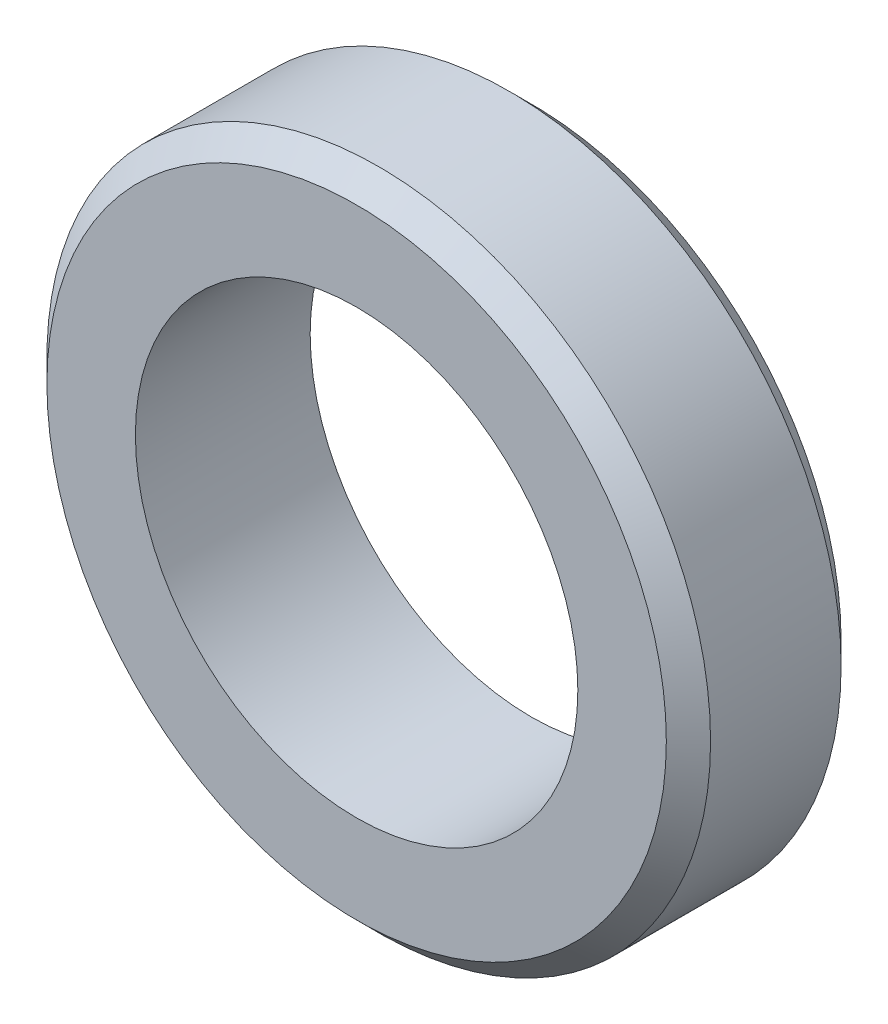
ISO-10303-21;
HEADER;
FILE_DESCRIPTION(('STEP AP214'),'2;1');
FILE_NAME('part.step','',(''),(''),'','','');
FILE_SCHEMA(('AUTOMOTIVE_DESIGN { 1 0 10303 214 1 1 1 1 }'));
ENDSEC;
DATA;
#1=APPLICATION_CONTEXT('core data for automotive mechanical design processes');
#2=APPLICATION_PROTOCOL_DEFINITION('international standard','automotive_design',2000,#1);
#3=PRODUCT_CONTEXT('',#1,'mechanical');
#4=PRODUCT('Part','Part','',(#3));
#5=PRODUCT_RELATED_PRODUCT_CATEGORY('part','',(#4));
#6=PRODUCT_DEFINITION_FORMATION('','',#4);
#7=PRODUCT_DEFINITION_CONTEXT('part definition',#1,'design');
#8=PRODUCT_DEFINITION('design','',#6,#7);
#9=PRODUCT_DEFINITION_SHAPE('','',#8);
#10=(LENGTH_UNIT() NAMED_UNIT(*) SI_UNIT(.MILLI.,.METRE.));
#11=(NAMED_UNIT(*) PLANE_ANGLE_UNIT() SI_UNIT($,.RADIAN.));
#12=(NAMED_UNIT(*) SI_UNIT($,.STERADIAN.) SOLID_ANGLE_UNIT());
#13=UNCERTAINTY_MEASURE_WITH_UNIT(LENGTH_MEASURE(1.E-05),#10,'distance_accuracy_value','');
#14=(GEOMETRIC_REPRESENTATION_CONTEXT(3) GLOBAL_UNCERTAINTY_ASSIGNED_CONTEXT((#13)) GLOBAL_UNIT_ASSIGNED_CONTEXT((#10,
#11,#12)) REPRESENTATION_CONTEXT('',''));
#15=CARTESIAN_POINT('',(0.,0.,0.));
#16=DIRECTION('',(0.,0.,1.));
#17=DIRECTION('',(1.,0.,0.));
#18=AXIS2_PLACEMENT_3D('',#15,#16,#17);
#19=CARTESIAN_POINT('',(0.,0.,10.033));
#20=DIRECTION('',(0.,0.,1.));
#21=DIRECTION('',(1.,0.,0.));
#22=AXIS2_PLACEMENT_3D('',#19,#20,#21);
#23=PLANE('',#22);
#24=CARTESIAN_POINT('',(0.,0.,10.033));
#25=DIRECTION('',(0.,0.,1.));
#26=DIRECTION('',(1.,0.,0.));
#27=AXIS2_PLACEMENT_3D('',#24,#25,#26);
#28=CIRCLE('',#27,17.78);
#29=CARTESIAN_POINT('',(17.78,0.,10.033));
#30=VERTEX_POINT('',#29);
#31=EDGE_CURVE('E10',#30,#30,#28,.T.);
#32=ORIENTED_EDGE('',*,*,#31,.T.);
#33=EDGE_LOOP('',(#32));
#34=FACE_BOUND('',#33,.T.);
#35=CARTESIAN_POINT('',(0.,0.,10.033));
#36=DIRECTION('',(0.,0.,1.));
#37=DIRECTION('',(1.,0.,0.));
#38=AXIS2_PLACEMENT_3D('',#35,#36,#37);
#39=CIRCLE('',#38,12.7);
#40=CARTESIAN_POINT('',(12.7,0.,10.033));
#41=VERTEX_POINT('',#40);
#42=EDGE_CURVE('E51',#41,#41,#39,.T.);
#43=ORIENTED_EDGE('',*,*,#42,.F.);
#44=EDGE_LOOP('',(#43));
#45=FACE_BOUND('',#44,.T.);
#46=ADVANCED_FACE('F31',(#34,#45),#23,.T.);
#47=CARTESIAN_POINT('',(0.,0.,0.));
#48=DIRECTION('',(0.,0.,1.));
#49=DIRECTION('',(1.,0.,0.));
#50=AXIS2_PLACEMENT_3D('',#47,#48,#49);
#51=PLANE('',#50);
#52=CARTESIAN_POINT('',(0.,0.,0.));
#53=DIRECTION('',(0.,0.,1.));
#54=DIRECTION('',(1.,0.,0.));
#55=AXIS2_PLACEMENT_3D('',#52,#53,#54);
#56=CIRCLE('',#55,17.78);
#57=CARTESIAN_POINT('',(17.78,0.,0.));
#58=VERTEX_POINT('',#57);
#59=EDGE_CURVE('E38',#58,#58,#56,.F.);
#60=ORIENTED_EDGE('',*,*,#59,.T.);
#61=EDGE_LOOP('',(#60));
#62=FACE_BOUND('',#61,.T.);
#63=CARTESIAN_POINT('',(0.,0.,0.));
#64=DIRECTION('',(0.,0.,1.));
#65=DIRECTION('',(1.,0.,0.));
#66=AXIS2_PLACEMENT_3D('',#63,#64,#65);
#67=CIRCLE('',#66,12.7);
#68=CARTESIAN_POINT('',(12.7,0.,0.));
#69=VERTEX_POINT('',#68);
#70=EDGE_CURVE('E52',#69,#69,#67,.T.);
#71=ORIENTED_EDGE('',*,*,#70,.T.);
#72=EDGE_LOOP('',(#71));
#73=FACE_BOUND('',#72,.T.);
#74=ADVANCED_FACE('F62',(#62,#73),#51,.F.);
#75=CARTESIAN_POINT('',(0.,0.,10.033));
#76=DIRECTION('',(0.,0.,-1.));
#77=DIRECTION('',(-1.,0.,0.));
#78=AXIS2_PLACEMENT_3D('',#75,#76,#77);
#79=CYLINDRICAL_SURFACE('',#78,19.05);
#80=CARTESIAN_POINT('',(0.,0.,1.27));
#81=DIRECTION('',(0.,0.,1.));
#82=DIRECTION('',(1.,0.,0.));
#83=AXIS2_PLACEMENT_3D('',#80,#81,#82);
#84=CIRCLE('',#83,19.05);
#85=CARTESIAN_POINT('',(19.05,0.,1.27));
#86=VERTEX_POINT('',#85);
#87=EDGE_CURVE('E42',#86,#86,#84,.T.);
#88=ORIENTED_EDGE('',*,*,#87,.T.);
#89=EDGE_LOOP('',(#88));
#90=FACE_BOUND('',#89,.T.);
#91=CARTESIAN_POINT('',(0.,0.,8.76299999999998));
#92=DIRECTION('',(0.,0.,1.));
#93=DIRECTION('',(1.,0.,0.));
#94=AXIS2_PLACEMENT_3D('',#91,#92,#93);
#95=CIRCLE('',#94,19.05);
#96=CARTESIAN_POINT('',(19.05,0.,8.76299999999998));
#97=VERTEX_POINT('',#96);
#98=EDGE_CURVE('E46',#97,#97,#95,.F.);
#99=ORIENTED_EDGE('',*,*,#98,.T.);
#100=EDGE_LOOP('',(#99));
#101=FACE_BOUND('',#100,.T.);
#102=ADVANCED_FACE('F67',(#90,#101),#79,.T.);
#103=CARTESIAN_POINT('',(0.,0.,10.033));
#104=DIRECTION('',(0.,0.,-1.));
#105=DIRECTION('',(-1.,0.,0.));
#106=AXIS2_PLACEMENT_3D('',#103,#104,#105);
#107=CYLINDRICAL_SURFACE('',#106,12.7);
#108=ORIENTED_EDGE('',*,*,#42,.T.);
#109=EDGE_LOOP('',(#108));
#110=FACE_BOUND('',#109,.T.);
#111=ORIENTED_EDGE('',*,*,#70,.F.);
#112=EDGE_LOOP('',(#111));
#113=FACE_BOUND('',#112,.T.);
#114=ADVANCED_FACE('F58',(#110,#113),#107,.F.);
#115=CARTESIAN_POINT('',(0.,0.,1.27));
#116=DIRECTION('',(0.,0.,1.));
#117=DIRECTION('',(1.,0.,0.));
#118=AXIS2_PLACEMENT_3D('',#115,#116,#117);
#119=CONICAL_SURFACE('',#118,19.05,0.785398163397451);
#120=ORIENTED_EDGE('',*,*,#59,.F.);
#121=EDGE_LOOP('',(#120));
#122=FACE_BOUND('',#121,.T.);
#123=ORIENTED_EDGE('',*,*,#87,.F.);
#124=EDGE_LOOP('',(#123));
#125=FACE_BOUND('',#124,.T.);
#126=ADVANCED_FACE('F73',(#122,#125),#119,.T.);
#127=CARTESIAN_POINT('',(0.,0.,10.033));
#128=DIRECTION('',(0.,0.,-1.));
#129=DIRECTION('',(-1.,0.,0.));
#130=AXIS2_PLACEMENT_3D('',#127,#128,#129);
#131=CONICAL_SURFACE('',#130,17.78,0.785398163397447);
#132=ORIENTED_EDGE('',*,*,#98,.F.);
#133=EDGE_LOOP('',(#132));
#134=FACE_BOUND('',#133,.T.);
#135=ORIENTED_EDGE('',*,*,#31,.F.);
#136=EDGE_LOOP('',(#135));
#137=FACE_BOUND('',#136,.T.);
#138=ADVANCED_FACE('F33',(#134,#137),#131,.T.);
#139=CLOSED_SHELL('',(#46,#74,#102,#114,#126,#138));
#140=MANIFOLD_SOLID_BREP('B2',#139);
#141=ADVANCED_BREP_SHAPE_REPRESENTATION('',(#18,#140),#14);
#142=SHAPE_DEFINITION_REPRESENTATION(#9,#141);
ENDSEC;
END-ISO-10303-21;
